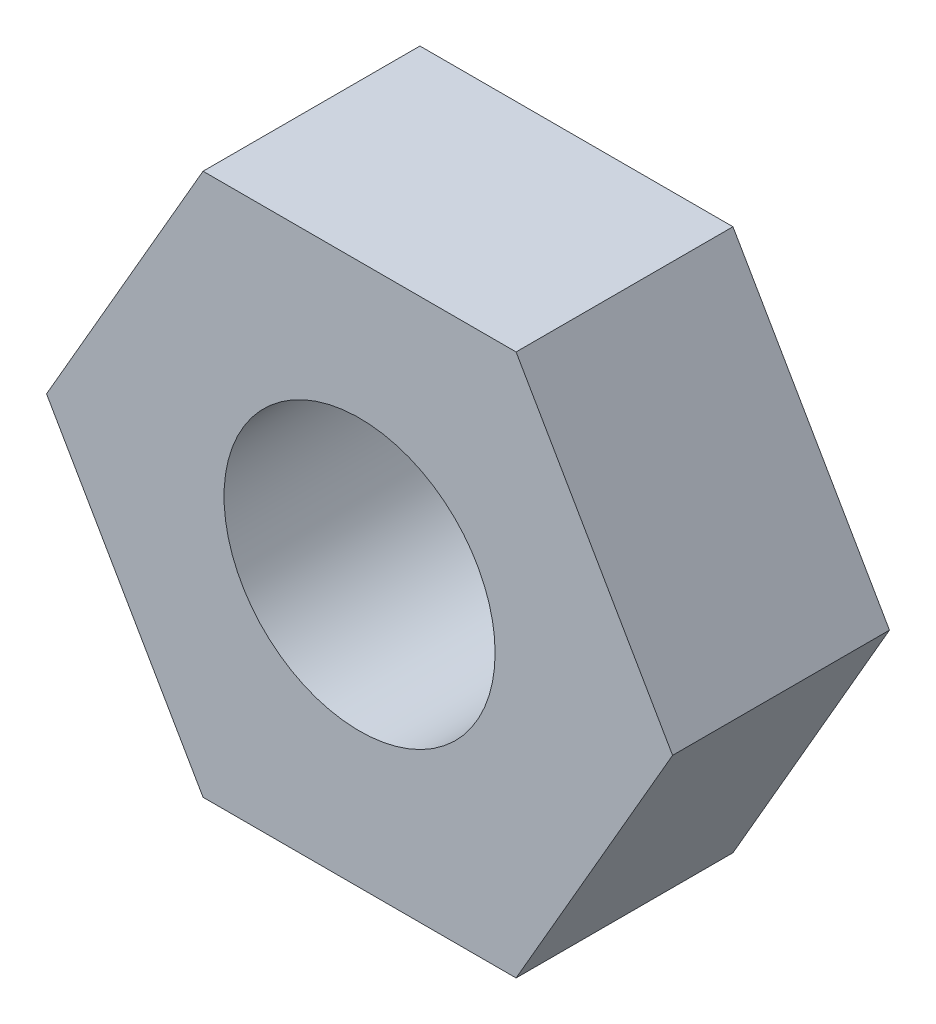
ISO-10303-21;
HEADER;
FILE_DESCRIPTION(('STEP AP214'),'2;1');
FILE_NAME('part.step','',(''),(''),'','','');
FILE_SCHEMA(('AUTOMOTIVE_DESIGN { 1 0 10303 214 1 1 1 1 }'));
ENDSEC;
DATA;
#1=APPLICATION_CONTEXT('core data for automotive mechanical design processes');
#2=APPLICATION_PROTOCOL_DEFINITION('international standard','automotive_design',2000,#1);
#3=PRODUCT_CONTEXT('',#1,'mechanical');
#4=PRODUCT('Part','Part','',(#3));
#5=PRODUCT_RELATED_PRODUCT_CATEGORY('part','',(#4));
#6=PRODUCT_DEFINITION_FORMATION('','',#4);
#7=PRODUCT_DEFINITION_CONTEXT('part definition',#1,'design');
#8=PRODUCT_DEFINITION('design','',#6,#7);
#9=PRODUCT_DEFINITION_SHAPE('','',#8);
#10=(LENGTH_UNIT() NAMED_UNIT(*) SI_UNIT(.MILLI.,.METRE.));
#11=(NAMED_UNIT(*) PLANE_ANGLE_UNIT() SI_UNIT($,.RADIAN.));
#12=(NAMED_UNIT(*) SI_UNIT($,.STERADIAN.) SOLID_ANGLE_UNIT());
#13=UNCERTAINTY_MEASURE_WITH_UNIT(LENGTH_MEASURE(1.E-05),#10,'distance_accuracy_value','');
#14=(GEOMETRIC_REPRESENTATION_CONTEXT(3) GLOBAL_UNCERTAINTY_ASSIGNED_CONTEXT((#13)) GLOBAL_UNIT_ASSIGNED_CONTEXT((#10,
#11,#12)) REPRESENTATION_CONTEXT('',''));
#15=CARTESIAN_POINT('',(0.,0.,0.));
#16=DIRECTION('',(0.,0.,1.));
#17=DIRECTION('',(1.,0.,0.));
#18=AXIS2_PLACEMENT_3D('',#15,#16,#17);
#19=CARTESIAN_POINT('',(0.,0.,2.));
#20=DIRECTION('',(0.,0.,1.));
#21=DIRECTION('',(1.,0.,0.));
#22=AXIS2_PLACEMENT_3D('',#19,#20,#21);
#23=PLANE('',#22);
#24=DIRECTION('',(0.5,0.866025403784439,0.));
#25=VECTOR('',#24,1.);
#26=CARTESIAN_POINT('',(1.44337567297406,-2.5,2.));
#27=LINE('',#26,#25);
#28=CARTESIAN_POINT('',(1.44337567297406,-2.5,2.));
#29=VERTEX_POINT('',#28);
#30=CARTESIAN_POINT('',(2.88675134594813,0.,2.));
#31=VERTEX_POINT('',#30);
#32=EDGE_CURVE('E140',#29,#31,#27,.T.);
#33=ORIENTED_EDGE('',*,*,#32,.T.);
#34=DIRECTION('',(-0.5,0.866025403784439,0.));
#35=VECTOR('',#34,1.);
#36=CARTESIAN_POINT('',(2.88675134594813,0.,2.));
#37=LINE('',#36,#35);
#38=CARTESIAN_POINT('',(1.44337567297406,2.5,2.));
#39=VERTEX_POINT('',#38);
#40=EDGE_CURVE('E94',#31,#39,#37,.T.);
#41=ORIENTED_EDGE('',*,*,#40,.T.);
#42=DIRECTION('',(-1.,0.,0.));
#43=VECTOR('',#42,1.);
#44=CARTESIAN_POINT('',(1.44337567297406,2.5,2.));
#45=LINE('',#44,#43);
#46=CARTESIAN_POINT('',(-1.44337567297406,2.5,2.));
#47=VERTEX_POINT('',#46);
#48=EDGE_CURVE('E108',#39,#47,#45,.T.);
#49=ORIENTED_EDGE('',*,*,#48,.T.);
#50=DIRECTION('',(-0.5,-0.866025403784439,0.));
#51=VECTOR('',#50,1.);
#52=CARTESIAN_POINT('',(-1.44337567297406,2.5,2.));
#53=LINE('',#52,#51);
#54=CARTESIAN_POINT('',(-2.88675134594813,0.,2.));
#55=VERTEX_POINT('',#54);
#56=EDGE_CURVE('E105',#47,#55,#53,.T.);
#57=ORIENTED_EDGE('',*,*,#56,.T.);
#58=DIRECTION('',(0.5,-0.866025403784439,0.));
#59=VECTOR('',#58,1.);
#60=CARTESIAN_POINT('',(-2.88675134594813,0.,2.));
#61=LINE('',#60,#59);
#62=CARTESIAN_POINT('',(-1.44337567297407,-2.5,2.));
#63=VERTEX_POINT('',#62);
#64=EDGE_CURVE('E106',#55,#63,#61,.T.);
#65=ORIENTED_EDGE('',*,*,#64,.T.);
#66=DIRECTION('',(1.,0.,0.));
#67=VECTOR('',#66,1.);
#68=CARTESIAN_POINT('',(-1.44337567297407,-2.5,2.));
#69=LINE('',#68,#67);
#70=EDGE_CURVE('E59',#63,#29,#69,.T.);
#71=ORIENTED_EDGE('',*,*,#70,.T.);
#72=EDGE_LOOP('',(#33,#41,#49,#57,#65,#71));
#73=FACE_BOUND('',#72,.T.);
#74=CARTESIAN_POINT('',(0.,0.,2.));
#75=DIRECTION('',(0.,0.,1.));
#76=DIRECTION('',(1.,0.,0.));
#77=AXIS2_PLACEMENT_3D('',#74,#75,#76);
#78=CIRCLE('',#77,1.25);
#79=CARTESIAN_POINT('',(1.25,0.,2.));
#80=VERTEX_POINT('',#79);
#81=EDGE_CURVE('E126',#80,#80,#78,.T.);
#82=ORIENTED_EDGE('',*,*,#81,.F.);
#83=EDGE_LOOP('',(#82));
#84=FACE_BOUND('',#83,.T.);
#85=ADVANCED_FACE('F41',(#73,#84),#23,.T.);
#86=CARTESIAN_POINT('',(0.,0.,0.));
#87=DIRECTION('',(0.,0.,1.));
#88=DIRECTION('',(1.,0.,0.));
#89=AXIS2_PLACEMENT_3D('',#86,#87,#88);
#90=PLANE('',#89);
#91=DIRECTION('',(0.5,0.866025403784439,0.));
#92=VECTOR('',#91,1.);
#93=CARTESIAN_POINT('',(1.44337567297406,-2.5,0.));
#94=LINE('',#93,#92);
#95=CARTESIAN_POINT('',(1.44337567297406,-2.5,0.));
#96=VERTEX_POINT('',#95);
#97=CARTESIAN_POINT('',(2.88675134594813,0.,0.));
#98=VERTEX_POINT('',#97);
#99=EDGE_CURVE('E128',#96,#98,#94,.T.);
#100=ORIENTED_EDGE('',*,*,#99,.F.);
#101=DIRECTION('',(1.,0.,0.));
#102=VECTOR('',#101,1.);
#103=CARTESIAN_POINT('',(-1.44337567297407,-2.5,0.));
#104=LINE('',#103,#102);
#105=CARTESIAN_POINT('',(-1.44337567297407,-2.5,0.));
#106=VERTEX_POINT('',#105);
#107=EDGE_CURVE('E90',#106,#96,#104,.T.);
#108=ORIENTED_EDGE('',*,*,#107,.F.);
#109=DIRECTION('',(0.5,-0.866025403784439,0.));
#110=VECTOR('',#109,1.);
#111=CARTESIAN_POINT('',(-2.88675134594813,0.,0.));
#112=LINE('',#111,#110);
#113=CARTESIAN_POINT('',(-2.88675134594813,0.,0.));
#114=VERTEX_POINT('',#113);
#115=EDGE_CURVE('E83',#114,#106,#112,.T.);
#116=ORIENTED_EDGE('',*,*,#115,.F.);
#117=DIRECTION('',(-0.5,-0.866025403784439,0.));
#118=VECTOR('',#117,1.);
#119=CARTESIAN_POINT('',(-1.44337567297406,2.5,0.));
#120=LINE('',#119,#118);
#121=CARTESIAN_POINT('',(-1.44337567297406,2.5,0.));
#122=VERTEX_POINT('',#121);
#123=EDGE_CURVE('E116',#122,#114,#120,.T.);
#124=ORIENTED_EDGE('',*,*,#123,.F.);
#125=DIRECTION('',(-1.,0.,0.));
#126=VECTOR('',#125,1.);
#127=CARTESIAN_POINT('',(1.44337567297406,2.5,0.));
#128=LINE('',#127,#126);
#129=CARTESIAN_POINT('',(1.44337567297406,2.5,0.));
#130=VERTEX_POINT('',#129);
#131=EDGE_CURVE('E135',#130,#122,#128,.T.);
#132=ORIENTED_EDGE('',*,*,#131,.F.);
#133=DIRECTION('',(-0.5,0.866025403784439,0.));
#134=VECTOR('',#133,1.);
#135=CARTESIAN_POINT('',(2.88675134594813,0.,0.));
#136=LINE('',#135,#134);
#137=EDGE_CURVE('E130',#98,#130,#136,.T.);
#138=ORIENTED_EDGE('',*,*,#137,.F.);
#139=EDGE_LOOP('',(#100,#108,#116,#124,#132,#138));
#140=FACE_BOUND('',#139,.T.);
#141=CARTESIAN_POINT('',(0.,0.,0.));
#142=DIRECTION('',(0.,0.,1.));
#143=DIRECTION('',(1.,0.,0.));
#144=AXIS2_PLACEMENT_3D('',#141,#142,#143);
#145=CIRCLE('',#144,1.25);
#146=CARTESIAN_POINT('',(1.25,0.,0.));
#147=VERTEX_POINT('',#146);
#148=EDGE_CURVE('E229',#147,#147,#145,.T.);
#149=ORIENTED_EDGE('',*,*,#148,.T.);
#150=EDGE_LOOP('',(#149));
#151=FACE_BOUND('',#150,.T.);
#152=ADVANCED_FACE('F148',(#140,#151),#90,.F.);
#153=CARTESIAN_POINT('',(1.44337567297406,-2.5,2.));
#154=DIRECTION('',(-0.866025403784439,0.5,0.));
#155=DIRECTION('',(-0.5,-0.866025403784439,0.));
#156=AXIS2_PLACEMENT_3D('',#153,#154,#155);
#157=PLANE('',#156);
#158=ORIENTED_EDGE('',*,*,#99,.T.);
#159=DIRECTION('',(0.,0.,-1.));
#160=VECTOR('',#159,1.);
#161=CARTESIAN_POINT('',(2.88675134594813,0.,2.));
#162=LINE('',#161,#160);
#163=EDGE_CURVE('E11',#31,#98,#162,.T.);
#164=ORIENTED_EDGE('',*,*,#163,.F.);
#165=ORIENTED_EDGE('',*,*,#32,.F.);
#166=DIRECTION('',(0.,0.,-1.));
#167=VECTOR('',#166,1.);
#168=CARTESIAN_POINT('',(1.44337567297406,-2.5,2.));
#169=LINE('',#168,#167);
#170=EDGE_CURVE('E125',#29,#96,#169,.T.);
#171=ORIENTED_EDGE('',*,*,#170,.T.);
#172=EDGE_LOOP('',(#158,#164,#165,#171));
#173=FACE_BOUND('',#172,.T.);
#174=ADVANCED_FACE('F43',(#173),#157,.F.);
#175=CARTESIAN_POINT('',(2.88675134594813,0.,2.));
#176=DIRECTION('',(-0.866025403784439,-0.5,0.));
#177=DIRECTION('',(0.5,-0.866025403784439,0.));
#178=AXIS2_PLACEMENT_3D('',#175,#176,#177);
#179=PLANE('',#178);
#180=ORIENTED_EDGE('',*,*,#137,.T.);
#181=DIRECTION('',(0.,0.,-1.));
#182=VECTOR('',#181,1.);
#183=CARTESIAN_POINT('',(1.44337567297406,2.5,2.));
#184=LINE('',#183,#182);
#185=EDGE_CURVE('E49',#39,#130,#184,.T.);
#186=ORIENTED_EDGE('',*,*,#185,.F.);
#187=ORIENTED_EDGE('',*,*,#40,.F.);
#188=ORIENTED_EDGE('',*,*,#163,.T.);
#189=EDGE_LOOP('',(#180,#186,#187,#188));
#190=FACE_BOUND('',#189,.T.);
#191=ADVANCED_FACE('F171',(#190),#179,.F.);
#192=CARTESIAN_POINT('',(1.44337567297406,2.5,2.));
#193=DIRECTION('',(0.,-1.,0.));
#194=DIRECTION('',(1.,0.,0.));
#195=AXIS2_PLACEMENT_3D('',#192,#193,#194);
#196=PLANE('',#195);
#197=ORIENTED_EDGE('',*,*,#131,.T.);
#198=DIRECTION('',(0.,0.,-1.));
#199=VECTOR('',#198,1.);
#200=CARTESIAN_POINT('',(-1.44337567297406,2.5,2.));
#201=LINE('',#200,#199);
#202=EDGE_CURVE('E120',#47,#122,#201,.T.);
#203=ORIENTED_EDGE('',*,*,#202,.F.);
#204=ORIENTED_EDGE('',*,*,#48,.F.);
#205=ORIENTED_EDGE('',*,*,#185,.T.);
#206=EDGE_LOOP('',(#197,#203,#204,#205));
#207=FACE_BOUND('',#206,.T.);
#208=ADVANCED_FACE('F141',(#207),#196,.F.);
#209=CARTESIAN_POINT('',(-1.44337567297406,2.5,2.));
#210=DIRECTION('',(0.866025403784439,-0.5,0.));
#211=DIRECTION('',(0.5,0.866025403784439,0.));
#212=AXIS2_PLACEMENT_3D('',#209,#210,#211);
#213=PLANE('',#212);
#214=ORIENTED_EDGE('',*,*,#123,.T.);
#215=DIRECTION('',(0.,0.,-1.));
#216=VECTOR('',#215,1.);
#217=CARTESIAN_POINT('',(-2.88675134594813,0.,2.));
#218=LINE('',#217,#216);
#219=EDGE_CURVE('E113',#55,#114,#218,.T.);
#220=ORIENTED_EDGE('',*,*,#219,.F.);
#221=ORIENTED_EDGE('',*,*,#56,.F.);
#222=ORIENTED_EDGE('',*,*,#202,.T.);
#223=EDGE_LOOP('',(#214,#220,#221,#222));
#224=FACE_BOUND('',#223,.T.);
#225=ADVANCED_FACE('F112',(#224),#213,.F.);
#226=CARTESIAN_POINT('',(-2.88675134594813,0.,2.));
#227=DIRECTION('',(0.866025403784439,0.5,0.));
#228=DIRECTION('',(-0.5,0.866025403784439,0.));
#229=AXIS2_PLACEMENT_3D('',#226,#227,#228);
#230=PLANE('',#229);
#231=ORIENTED_EDGE('',*,*,#115,.T.);
#232=DIRECTION('',(0.,0.,-1.));
#233=VECTOR('',#232,1.);
#234=CARTESIAN_POINT('',(-1.44337567297407,-2.5,2.));
#235=LINE('',#234,#233);
#236=EDGE_CURVE('E117',#63,#106,#235,.T.);
#237=ORIENTED_EDGE('',*,*,#236,.F.);
#238=ORIENTED_EDGE('',*,*,#64,.F.);
#239=ORIENTED_EDGE('',*,*,#219,.T.);
#240=EDGE_LOOP('',(#231,#237,#238,#239));
#241=FACE_BOUND('',#240,.T.);
#242=ADVANCED_FACE('F119',(#241),#230,.F.);
#243=CARTESIAN_POINT('',(-1.44337567297407,-2.5,2.));
#244=DIRECTION('',(0.,1.,0.));
#245=DIRECTION('',(-1.,0.,0.));
#246=AXIS2_PLACEMENT_3D('',#243,#244,#245);
#247=PLANE('',#246);
#248=ORIENTED_EDGE('',*,*,#107,.T.);
#249=ORIENTED_EDGE('',*,*,#170,.F.);
#250=ORIENTED_EDGE('',*,*,#70,.F.);
#251=ORIENTED_EDGE('',*,*,#236,.T.);
#252=EDGE_LOOP('',(#248,#249,#250,#251));
#253=FACE_BOUND('',#252,.T.);
#254=ADVANCED_FACE('F153',(#253),#247,.F.);
#255=CARTESIAN_POINT('',(0.,0.,2.));
#256=DIRECTION('',(0.,0.,-1.));
#257=DIRECTION('',(-1.,0.,0.));
#258=AXIS2_PLACEMENT_3D('',#255,#256,#257);
#259=CYLINDRICAL_SURFACE('',#258,1.25);
#260=ORIENTED_EDGE('',*,*,#81,.T.);
#261=EDGE_LOOP('',(#260));
#262=FACE_BOUND('',#261,.T.);
#263=ORIENTED_EDGE('',*,*,#148,.F.);
#264=EDGE_LOOP('',(#263));
#265=FACE_BOUND('',#264,.T.);
#266=ADVANCED_FACE('F151',(#262,#265),#259,.F.);
#267=CLOSED_SHELL('',(#85,#152,#174,#191,#208,#225,#242,#254,#266));
#268=MANIFOLD_SOLID_BREP('B2',#267);
#269=ADVANCED_BREP_SHAPE_REPRESENTATION('',(#18,#268),#14);
#270=SHAPE_DEFINITION_REPRESENTATION(#9,#269);
ENDSEC;
END-ISO-10303-21;
